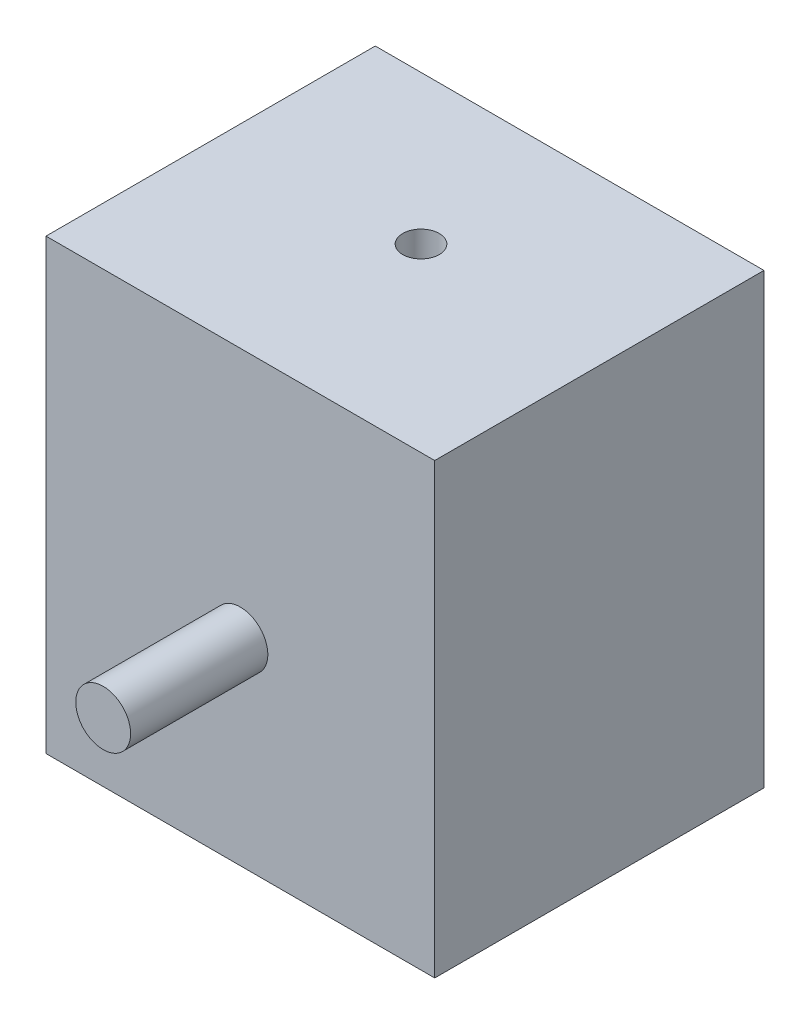
ISO-10303-21;
HEADER;
FILE_DESCRIPTION(('STEP AP214'),'2;1');
FILE_NAME('part.step','',(''),(''),'','','');
FILE_SCHEMA(('AUTOMOTIVE_DESIGN { 1 0 10303 214 1 1 1 1 }'));
ENDSEC;
DATA;
#1=APPLICATION_CONTEXT('core data for automotive mechanical design processes');
#2=APPLICATION_PROTOCOL_DEFINITION('international standard','automotive_design',2000,#1);
#3=PRODUCT_CONTEXT('',#1,'mechanical');
#4=PRODUCT('Part','Part','',(#3));
#5=PRODUCT_RELATED_PRODUCT_CATEGORY('part','',(#4));
#6=PRODUCT_DEFINITION_FORMATION('','',#4);
#7=PRODUCT_DEFINITION_CONTEXT('part definition',#1,'design');
#8=PRODUCT_DEFINITION('design','',#6,#7);
#9=PRODUCT_DEFINITION_SHAPE('','',#8);
#10=(LENGTH_UNIT() NAMED_UNIT(*) SI_UNIT(.MILLI.,.METRE.));
#11=(NAMED_UNIT(*) PLANE_ANGLE_UNIT() SI_UNIT($,.RADIAN.));
#12=(NAMED_UNIT(*) SI_UNIT($,.STERADIAN.) SOLID_ANGLE_UNIT());
#13=UNCERTAINTY_MEASURE_WITH_UNIT(LENGTH_MEASURE(1.E-05),#10,'distance_accuracy_value','');
#14=(GEOMETRIC_REPRESENTATION_CONTEXT(3) GLOBAL_UNCERTAINTY_ASSIGNED_CONTEXT((#13)) GLOBAL_UNIT_ASSIGNED_CONTEXT((#10,
#11,#12)) REPRESENTATION_CONTEXT('',''));
#15=CARTESIAN_POINT('',(0.,0.,0.));
#16=DIRECTION('',(0.,0.,1.));
#17=DIRECTION('',(1.,0.,0.));
#18=AXIS2_PLACEMENT_3D('',#15,#16,#17);
#19=CARTESIAN_POINT('',(-42.5,98.,36.));
#20=DIRECTION('',(0.,0.,-1.));
#21=DIRECTION('',(-1.,0.,0.));
#22=AXIS2_PLACEMENT_3D('',#19,#20,#21);
#23=PLANE('',#22);
#24=DIRECTION('',(1.,0.,0.));
#25=VECTOR('',#24,1.);
#26=CARTESIAN_POINT('',(-42.5,0.,36.));
#27=LINE('',#26,#25);
#28=CARTESIAN_POINT('',(-42.5,0.,36.));
#29=VERTEX_POINT('',#28);
#30=CARTESIAN_POINT('',(42.5,0.,36.));
#31=VERTEX_POINT('',#30);
#32=EDGE_CURVE('E73',#29,#31,#27,.T.);
#33=ORIENTED_EDGE('',*,*,#32,.T.);
#34=DIRECTION('',(0.,-1.,0.));
#35=VECTOR('',#34,1.);
#36=CARTESIAN_POINT('',(42.5,98.,36.));
#37=LINE('',#36,#35);
#38=CARTESIAN_POINT('',(42.5,98.,36.));
#39=VERTEX_POINT('',#38);
#40=EDGE_CURVE('E96',#39,#31,#37,.T.);
#41=ORIENTED_EDGE('',*,*,#40,.F.);
#42=DIRECTION('',(1.,0.,0.));
#43=VECTOR('',#42,1.);
#44=CARTESIAN_POINT('',(-42.5,98.,36.));
#45=LINE('',#44,#43);
#46=CARTESIAN_POINT('',(-42.5,98.,36.));
#47=VERTEX_POINT('',#46);
#48=EDGE_CURVE('E50',#47,#39,#45,.T.);
#49=ORIENTED_EDGE('',*,*,#48,.F.);
#50=DIRECTION('',(0.,-1.,0.));
#51=VECTOR('',#50,1.);
#52=CARTESIAN_POINT('',(-42.5,98.,36.));
#53=LINE('',#52,#51);
#54=EDGE_CURVE('E92',#47,#29,#53,.T.);
#55=ORIENTED_EDGE('',*,*,#54,.T.);
#56=EDGE_LOOP('',(#33,#41,#49,#55));
#57=FACE_BOUND('',#56,.T.);
#58=CARTESIAN_POINT('',(0.,43.,36.));
#59=DIRECTION('',(0.,0.,-1.));
#60=DIRECTION('',(-1.,0.,0.));
#61=AXIS2_PLACEMENT_3D('',#58,#59,#60);
#62=CIRCLE('',#61,6.);
#63=CARTESIAN_POINT('',(-6.,43.,36.));
#64=VERTEX_POINT('',#63);
#65=EDGE_CURVE('E11',#64,#64,#62,.F.);
#66=ORIENTED_EDGE('',*,*,#65,.F.);
#67=EDGE_LOOP('',(#66));
#68=FACE_BOUND('',#67,.T.);
#69=ADVANCED_FACE('F33',(#57,#68),#23,.F.);
#70=CARTESIAN_POINT('',(42.5,98.,-36.));
#71=DIRECTION('',(-1.,0.,0.));
#72=DIRECTION('',(0.,0.,1.));
#73=AXIS2_PLACEMENT_3D('',#70,#71,#72);
#74=PLANE('',#73);
#75=DIRECTION('',(0.,0.,-1.));
#76=VECTOR('',#75,1.);
#77=CARTESIAN_POINT('',(42.5,0.,-36.));
#78=LINE('',#77,#76);
#79=CARTESIAN_POINT('',(42.5,0.,-36.));
#80=VERTEX_POINT('',#79);
#81=EDGE_CURVE('E100',#31,#80,#78,.T.);
#82=ORIENTED_EDGE('',*,*,#81,.T.);
#83=DIRECTION('',(0.,-1.,0.));
#84=VECTOR('',#83,1.);
#85=CARTESIAN_POINT('',(42.5,98.,-36.));
#86=LINE('',#85,#84);
#87=CARTESIAN_POINT('',(42.5,98.,-36.));
#88=VERTEX_POINT('',#87);
#89=EDGE_CURVE('E42',#88,#80,#86,.T.);
#90=ORIENTED_EDGE('',*,*,#89,.F.);
#91=DIRECTION('',(0.,0.,-1.));
#92=VECTOR('',#91,1.);
#93=CARTESIAN_POINT('',(42.5,98.,-36.));
#94=LINE('',#93,#92);
#95=EDGE_CURVE('E86',#39,#88,#94,.T.);
#96=ORIENTED_EDGE('',*,*,#95,.F.);
#97=ORIENTED_EDGE('',*,*,#40,.T.);
#98=EDGE_LOOP('',(#82,#90,#96,#97));
#99=FACE_BOUND('',#98,.T.);
#100=ADVANCED_FACE('F35',(#99),#74,.F.);
#101=CARTESIAN_POINT('',(-42.5,98.,-36.));
#102=DIRECTION('',(0.,0.,1.));
#103=DIRECTION('',(1.,0.,0.));
#104=AXIS2_PLACEMENT_3D('',#101,#102,#103);
#105=PLANE('',#104);
#106=DIRECTION('',(-1.,0.,0.));
#107=VECTOR('',#106,1.);
#108=CARTESIAN_POINT('',(-42.5,0.,-36.));
#109=LINE('',#108,#107);
#110=CARTESIAN_POINT('',(-42.5,0.,-36.));
#111=VERTEX_POINT('',#110);
#112=EDGE_CURVE('E91',#80,#111,#109,.T.);
#113=ORIENTED_EDGE('',*,*,#112,.T.);
#114=DIRECTION('',(0.,-1.,0.));
#115=VECTOR('',#114,1.);
#116=CARTESIAN_POINT('',(-42.5,98.,-36.));
#117=LINE('',#116,#115);
#118=CARTESIAN_POINT('',(-42.5,98.,-36.));
#119=VERTEX_POINT('',#118);
#120=EDGE_CURVE('E89',#119,#111,#117,.T.);
#121=ORIENTED_EDGE('',*,*,#120,.F.);
#122=DIRECTION('',(-1.,0.,0.));
#123=VECTOR('',#122,1.);
#124=CARTESIAN_POINT('',(-42.5,98.,-36.));
#125=LINE('',#124,#123);
#126=EDGE_CURVE('E81',#88,#119,#125,.T.);
#127=ORIENTED_EDGE('',*,*,#126,.F.);
#128=ORIENTED_EDGE('',*,*,#89,.T.);
#129=EDGE_LOOP('',(#113,#121,#127,#128));
#130=FACE_BOUND('',#129,.T.);
#131=ADVANCED_FACE('F90',(#130),#105,.F.);
#132=CARTESIAN_POINT('',(-42.5,98.,-36.));
#133=DIRECTION('',(1.,0.,0.));
#134=DIRECTION('',(0.,0.,-1.));
#135=AXIS2_PLACEMENT_3D('',#132,#133,#134);
#136=PLANE('',#135);
#137=DIRECTION('',(0.,0.,1.));
#138=VECTOR('',#137,1.);
#139=CARTESIAN_POINT('',(-42.5,0.,-36.));
#140=LINE('',#139,#138);
#141=EDGE_CURVE('E67',#111,#29,#140,.T.);
#142=ORIENTED_EDGE('',*,*,#141,.T.);
#143=ORIENTED_EDGE('',*,*,#54,.F.);
#144=DIRECTION('',(0.,0.,1.));
#145=VECTOR('',#144,1.);
#146=CARTESIAN_POINT('',(-42.5,98.,-36.));
#147=LINE('',#146,#145);
#148=EDGE_CURVE('E84',#119,#47,#147,.T.);
#149=ORIENTED_EDGE('',*,*,#148,.F.);
#150=ORIENTED_EDGE('',*,*,#120,.T.);
#151=EDGE_LOOP('',(#142,#143,#149,#150));
#152=FACE_BOUND('',#151,.T.);
#153=ADVANCED_FACE('F94',(#152),#136,.F.);
#154=CARTESIAN_POINT('',(0.,98.,0.));
#155=DIRECTION('',(0.,1.,0.));
#156=DIRECTION('',(0.,0.,1.));
#157=AXIS2_PLACEMENT_3D('',#154,#155,#156);
#158=PLANE('',#157);
#159=CARTESIAN_POINT('',(0.,98.,-3.49999999999999));
#160=DIRECTION('',(0.,1.,0.));
#161=DIRECTION('',(0.,0.,1.));
#162=AXIS2_PLACEMENT_3D('',#159,#160,#161);
#163=CIRCLE('',#162,4.);
#164=CARTESIAN_POINT('',(0.,98.,0.500000000000011));
#165=VERTEX_POINT('',#164);
#166=EDGE_CURVE('E193',#165,#165,#163,.T.);
#167=ORIENTED_EDGE('',*,*,#166,.F.);
#168=EDGE_LOOP('',(#167));
#169=FACE_BOUND('',#168,.T.);
#170=ORIENTED_EDGE('',*,*,#95,.T.);
#171=ORIENTED_EDGE('',*,*,#126,.T.);
#172=ORIENTED_EDGE('',*,*,#148,.T.);
#173=ORIENTED_EDGE('',*,*,#48,.T.);
#174=EDGE_LOOP('',(#170,#171,#172,#173));
#175=FACE_BOUND('',#174,.T.);
#176=ADVANCED_FACE('F82',(#169,#175),#158,.T.);
#177=CARTESIAN_POINT('',(0.,0.,0.));
#178=DIRECTION('',(0.,1.,0.));
#179=DIRECTION('',(0.,0.,1.));
#180=AXIS2_PLACEMENT_3D('',#177,#178,#179);
#181=PLANE('',#180);
#182=ORIENTED_EDGE('',*,*,#81,.F.);
#183=ORIENTED_EDGE('',*,*,#32,.F.);
#184=ORIENTED_EDGE('',*,*,#141,.F.);
#185=ORIENTED_EDGE('',*,*,#112,.F.);
#186=EDGE_LOOP('',(#182,#183,#184,#185));
#187=FACE_BOUND('',#186,.T.);
#188=ADVANCED_FACE('F111',(#187),#181,.F.);
#189=CARTESIAN_POINT('',(0.,88.,-3.49999999999999));
#190=DIRECTION('',(0.,1.,0.));
#191=DIRECTION('',(0.,0.,1.));
#192=AXIS2_PLACEMENT_3D('',#189,#190,#191);
#193=CYLINDRICAL_SURFACE('',#192,4.);
#194=CARTESIAN_POINT('',(0.,88.,-3.49999999999999));
#195=DIRECTION('',(0.,1.,0.));
#196=DIRECTION('',(0.,0.,1.));
#197=AXIS2_PLACEMENT_3D('',#194,#195,#196);
#198=CIRCLE('',#197,4.);
#199=CARTESIAN_POINT('',(0.,88.,0.500000000000011));
#200=VERTEX_POINT('',#199);
#201=EDGE_CURVE('E103',#200,#200,#198,.T.);
#202=ORIENTED_EDGE('',*,*,#201,.F.);
#203=EDGE_LOOP('',(#202));
#204=FACE_BOUND('',#203,.T.);
#205=ORIENTED_EDGE('',*,*,#166,.T.);
#206=EDGE_LOOP('',(#205));
#207=FACE_BOUND('',#206,.T.);
#208=ADVANCED_FACE('F113',(#204,#207),#193,.F.);
#209=CARTESIAN_POINT('',(0.,88.,-3.49999999999999));
#210=DIRECTION('',(0.,1.,0.));
#211=DIRECTION('',(0.,0.,1.));
#212=AXIS2_PLACEMENT_3D('',#209,#210,#211);
#213=PLANE('',#212);
#214=ORIENTED_EDGE('',*,*,#201,.T.);
#215=EDGE_LOOP('',(#214));
#216=FACE_BOUND('',#215,.T.);
#217=ADVANCED_FACE('F119',(#216),#213,.T.);
#218=CARTESIAN_POINT('',(0.,43.,66.));
#219=DIRECTION('',(0.,0.,-1.));
#220=DIRECTION('',(-1.,0.,0.));
#221=AXIS2_PLACEMENT_3D('',#218,#219,#220);
#222=CYLINDRICAL_SURFACE('',#221,6.);
#223=CARTESIAN_POINT('',(0.,43.,66.));
#224=DIRECTION('',(0.,0.,1.));
#225=DIRECTION('',(1.,0.,0.));
#226=AXIS2_PLACEMENT_3D('',#223,#224,#225);
#227=CIRCLE('',#226,6.);
#228=CARTESIAN_POINT('',(6.,43.,66.));
#229=VERTEX_POINT('',#228);
#230=EDGE_CURVE('E192',#229,#229,#227,.T.);
#231=ORIENTED_EDGE('',*,*,#230,.F.);
#232=EDGE_LOOP('',(#231));
#233=FACE_BOUND('',#232,.T.);
#234=ORIENTED_EDGE('',*,*,#65,.T.);
#235=EDGE_LOOP('',(#234));
#236=FACE_BOUND('',#235,.T.);
#237=ADVANCED_FACE('F162',(#233,#236),#222,.T.);
#238=CARTESIAN_POINT('',(0.,43.,66.));
#239=DIRECTION('',(0.,0.,1.));
#240=DIRECTION('',(1.,0.,0.));
#241=AXIS2_PLACEMENT_3D('',#238,#239,#240);
#242=PLANE('',#241);
#243=ORIENTED_EDGE('',*,*,#230,.T.);
#244=EDGE_LOOP('',(#243));
#245=FACE_BOUND('',#244,.T.);
#246=ADVANCED_FACE('F176',(#245),#242,.T.);
#247=CLOSED_SHELL('',(#69,#100,#131,#153,#176,#188,#208,#217,#237,#246));
#248=MANIFOLD_SOLID_BREP('B2',#247);
#249=ADVANCED_BREP_SHAPE_REPRESENTATION('',(#18,#248),#14);
#250=SHAPE_DEFINITION_REPRESENTATION(#9,#249);
ENDSEC;
END-ISO-10303-21;
